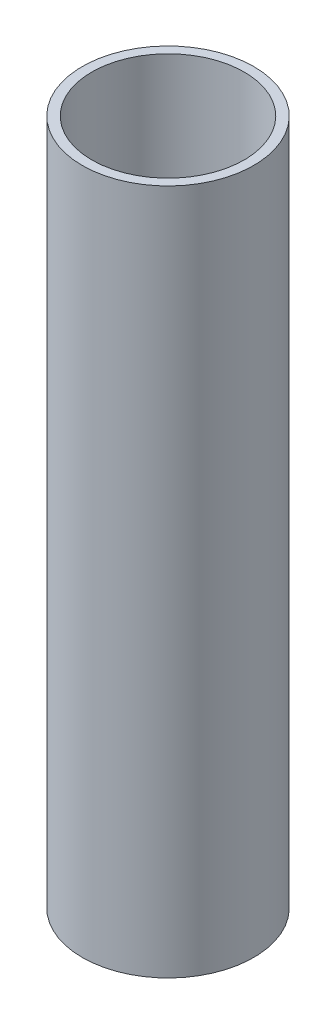
ISO-10303-21;
HEADER;
FILE_DESCRIPTION(('STEP AP214'),'2;1');
FILE_NAME('part.step','',(''),(''),'','','');
FILE_SCHEMA(('AUTOMOTIVE_DESIGN { 1 0 10303 214 1 1 1 1 }'));
ENDSEC;
DATA;
#1=APPLICATION_CONTEXT('core data for automotive mechanical design processes');
#2=APPLICATION_PROTOCOL_DEFINITION('international standard','automotive_design',2000,#1);
#3=PRODUCT_CONTEXT('',#1,'mechanical');
#4=PRODUCT('Part','Part','',(#3));
#5=PRODUCT_RELATED_PRODUCT_CATEGORY('part','',(#4));
#6=PRODUCT_DEFINITION_FORMATION('','',#4);
#7=PRODUCT_DEFINITION_CONTEXT('part definition',#1,'design');
#8=PRODUCT_DEFINITION('design','',#6,#7);
#9=PRODUCT_DEFINITION_SHAPE('','',#8);
#10=(LENGTH_UNIT() NAMED_UNIT(*) SI_UNIT(.MILLI.,.METRE.));
#11=(NAMED_UNIT(*) PLANE_ANGLE_UNIT() SI_UNIT($,.RADIAN.));
#12=(NAMED_UNIT(*) SI_UNIT($,.STERADIAN.) SOLID_ANGLE_UNIT());
#13=UNCERTAINTY_MEASURE_WITH_UNIT(LENGTH_MEASURE(1.E-05),#10,'distance_accuracy_value','');
#14=(GEOMETRIC_REPRESENTATION_CONTEXT(3) GLOBAL_UNCERTAINTY_ASSIGNED_CONTEXT((#13)) GLOBAL_UNIT_ASSIGNED_CONTEXT((#10,
#11,#12)) REPRESENTATION_CONTEXT('',''));
#15=CARTESIAN_POINT('',(0.,0.,0.));
#16=DIRECTION('',(0.,0.,1.));
#17=DIRECTION('',(1.,0.,0.));
#18=AXIS2_PLACEMENT_3D('',#15,#16,#17);
#19=CARTESIAN_POINT('',(0.,457.2,0.));
#20=DIRECTION('',(0.,1.,0.));
#21=DIRECTION('',(0.,0.,1.));
#22=AXIS2_PLACEMENT_3D('',#19,#20,#21);
#23=PLANE('',#22);
#24=CARTESIAN_POINT('',(0.,457.2,0.));
#25=DIRECTION('',(0.,1.,0.));
#26=DIRECTION('',(0.,0.,1.));
#27=AXIS2_PLACEMENT_3D('',#24,#25,#26);
#28=CIRCLE('',#27,57.15);
#29=CARTESIAN_POINT('',(0.,457.2,57.15));
#30=VERTEX_POINT('',#29);
#31=EDGE_CURVE('E10',#30,#30,#28,.T.);
#32=ORIENTED_EDGE('',*,*,#31,.T.);
#33=EDGE_LOOP('',(#32));
#34=FACE_BOUND('',#33,.T.);
#35=CARTESIAN_POINT('',(0.,457.2,0.));
#36=DIRECTION('',(0.,1.,0.));
#37=DIRECTION('',(0.,0.,1.));
#38=AXIS2_PLACEMENT_3D('',#35,#36,#37);
#39=CIRCLE('',#38,50.8);
#40=CARTESIAN_POINT('',(0.,457.2,50.8));
#41=VERTEX_POINT('',#40);
#42=EDGE_CURVE('E42',#41,#41,#39,.T.);
#43=ORIENTED_EDGE('',*,*,#42,.F.);
#44=EDGE_LOOP('',(#43));
#45=FACE_BOUND('',#44,.T.);
#46=ADVANCED_FACE('F31',(#34,#45),#23,.T.);
#47=CARTESIAN_POINT('',(0.,0.,0.));
#48=DIRECTION('',(0.,1.,0.));
#49=DIRECTION('',(0.,0.,1.));
#50=AXIS2_PLACEMENT_3D('',#47,#48,#49);
#51=PLANE('',#50);
#52=CARTESIAN_POINT('',(0.,0.,0.));
#53=DIRECTION('',(0.,1.,0.));
#54=DIRECTION('',(0.,0.,1.));
#55=AXIS2_PLACEMENT_3D('',#52,#53,#54);
#56=CIRCLE('',#55,57.15);
#57=CARTESIAN_POINT('',(0.,0.,57.15));
#58=VERTEX_POINT('',#57);
#59=EDGE_CURVE('E35',#58,#58,#56,.T.);
#60=ORIENTED_EDGE('',*,*,#59,.F.);
#61=EDGE_LOOP('',(#60));
#62=FACE_BOUND('',#61,.T.);
#63=CARTESIAN_POINT('',(0.,0.,0.));
#64=DIRECTION('',(0.,1.,0.));
#65=DIRECTION('',(0.,0.,1.));
#66=AXIS2_PLACEMENT_3D('',#63,#64,#65);
#67=CIRCLE('',#66,50.8);
#68=CARTESIAN_POINT('',(0.,0.,50.8));
#69=VERTEX_POINT('',#68);
#70=EDGE_CURVE('E44',#69,#69,#67,.T.);
#71=ORIENTED_EDGE('',*,*,#70,.T.);
#72=EDGE_LOOP('',(#71));
#73=FACE_BOUND('',#72,.T.);
#74=ADVANCED_FACE('F54',(#62,#73),#51,.F.);
#75=CARTESIAN_POINT('',(0.,457.2,0.));
#76=DIRECTION('',(0.,-1.,0.));
#77=DIRECTION('',(0.,0.,-1.));
#78=AXIS2_PLACEMENT_3D('',#75,#76,#77);
#79=CYLINDRICAL_SURFACE('',#78,57.15);
#80=ORIENTED_EDGE('',*,*,#31,.F.);
#81=EDGE_LOOP('',(#80));
#82=FACE_BOUND('',#81,.T.);
#83=ORIENTED_EDGE('',*,*,#59,.T.);
#84=EDGE_LOOP('',(#83));
#85=FACE_BOUND('',#84,.T.);
#86=ADVANCED_FACE('F33',(#82,#85),#79,.T.);
#87=CARTESIAN_POINT('',(0.,457.2,0.));
#88=DIRECTION('',(0.,-1.,0.));
#89=DIRECTION('',(0.,0.,-1.));
#90=AXIS2_PLACEMENT_3D('',#87,#88,#89);
#91=CYLINDRICAL_SURFACE('',#90,50.8);
#92=ORIENTED_EDGE('',*,*,#42,.T.);
#93=EDGE_LOOP('',(#92));
#94=FACE_BOUND('',#93,.T.);
#95=ORIENTED_EDGE('',*,*,#70,.F.);
#96=EDGE_LOOP('',(#95));
#97=FACE_BOUND('',#96,.T.);
#98=ADVANCED_FACE('F50',(#94,#97),#91,.F.);
#99=CLOSED_SHELL('',(#46,#74,#86,#98));
#100=MANIFOLD_SOLID_BREP('B2',#99);
#101=ADVANCED_BREP_SHAPE_REPRESENTATION('',(#18,#100),#14);
#102=SHAPE_DEFINITION_REPRESENTATION(#9,#101);
ENDSEC;
END-ISO-10303-21;
